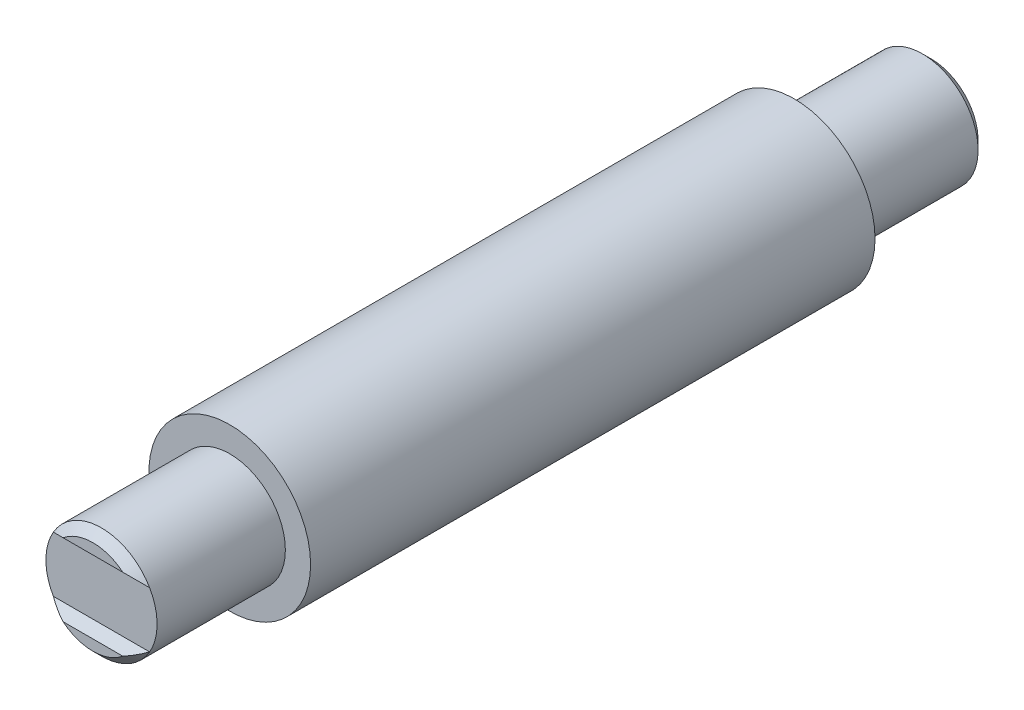
ISO-10303-21;
HEADER;
FILE_DESCRIPTION(('STEP AP214'),'2;1');
FILE_NAME('part.step','',(''),(''),'','','');
FILE_SCHEMA(('AUTOMOTIVE_DESIGN { 1 0 10303 214 1 1 1 1 }'));
ENDSEC;
DATA;
#1=APPLICATION_CONTEXT('core data for automotive mechanical design processes');
#2=APPLICATION_PROTOCOL_DEFINITION('international standard','automotive_design',2000,#1);
#3=PRODUCT_CONTEXT('',#1,'mechanical');
#4=PRODUCT('Part','Part','',(#3));
#5=PRODUCT_RELATED_PRODUCT_CATEGORY('part','',(#4));
#6=PRODUCT_DEFINITION_FORMATION('','',#4);
#7=PRODUCT_DEFINITION_CONTEXT('part definition',#1,'design');
#8=PRODUCT_DEFINITION('design','',#6,#7);
#9=PRODUCT_DEFINITION_SHAPE('','',#8);
#10=(LENGTH_UNIT() NAMED_UNIT(*) SI_UNIT(.MILLI.,.METRE.));
#11=(NAMED_UNIT(*) PLANE_ANGLE_UNIT() SI_UNIT($,.RADIAN.));
#12=(NAMED_UNIT(*) SI_UNIT($,.STERADIAN.) SOLID_ANGLE_UNIT());
#13=UNCERTAINTY_MEASURE_WITH_UNIT(LENGTH_MEASURE(1.E-05),#10,'distance_accuracy_value','');
#14=(GEOMETRIC_REPRESENTATION_CONTEXT(3) GLOBAL_UNCERTAINTY_ASSIGNED_CONTEXT((#13)) GLOBAL_UNIT_ASSIGNED_CONTEXT((#10,
#11,#12)) REPRESENTATION_CONTEXT('',''));
#15=CARTESIAN_POINT('',(0.,0.,0.));
#16=DIRECTION('',(0.,0.,1.));
#17=DIRECTION('',(1.,0.,0.));
#18=AXIS2_PLACEMENT_3D('',#15,#16,#17);
#19=CARTESIAN_POINT('',(0.,0.,82.));
#20=DIRECTION('',(0.,0.,1.));
#21=DIRECTION('',(1.,0.,0.));
#22=AXIS2_PLACEMENT_3D('',#19,#20,#21);
#23=PLANE('',#22);
#24=DIRECTION('',(1.,0.,0.));
#25=VECTOR('',#24,1.);
#26=CARTESIAN_POINT('',(5.7662812973354,4.25000000000001,82.));
#27=LINE('',#26,#25);
#28=CARTESIAN_POINT('',(-3.49106001094219,4.25000000000001,82.));
#29=VERTEX_POINT('',#28);
#30=CARTESIAN_POINT('',(3.49106001094219,4.25000000000001,82.));
#31=VERTEX_POINT('',#30);
#32=EDGE_CURVE('E102',#29,#31,#27,.T.);
#33=ORIENTED_EDGE('',*,*,#32,.T.);
#34=CARTESIAN_POINT('',(0.,0.,82.));
#35=DIRECTION('',(0.,0.,1.));
#36=DIRECTION('',(1.,0.,0.));
#37=AXIS2_PLACEMENT_3D('',#34,#35,#36);
#38=CIRCLE('',#37,5.49999999999998);
#39=EDGE_CURVE('E165',#31,#29,#38,.T.);
#40=ORIENTED_EDGE('',*,*,#39,.T.);
#41=EDGE_LOOP('',(#33,#40));
#42=FACE_BOUND('',#41,.T.);
#43=ADVANCED_FACE('F51',(#42),#23,.T.);
#44=CARTESIAN_POINT('',(0.,0.,66.));
#45=DIRECTION('',(0.,0.,-1.));
#46=DIRECTION('',(-1.,0.,0.));
#47=AXIS2_PLACEMENT_3D('',#44,#45,#46);
#48=CYLINDRICAL_SURFACE('',#47,9.45);
#49=CARTESIAN_POINT('',(0.,0.,66.));
#50=DIRECTION('',(0.,0.,1.));
#51=DIRECTION('',(1.,0.,0.));
#52=AXIS2_PLACEMENT_3D('',#49,#50,#51);
#53=CIRCLE('',#52,9.45);
#54=CARTESIAN_POINT('',(9.45,0.,66.));
#55=VERTEX_POINT('',#54);
#56=EDGE_CURVE('E189',#55,#55,#53,.T.);
#57=ORIENTED_EDGE('',*,*,#56,.F.);
#58=EDGE_LOOP('',(#57));
#59=FACE_BOUND('',#58,.T.);
#60=CARTESIAN_POINT('',(0.,0.,0.));
#61=DIRECTION('',(0.,0.,1.));
#62=DIRECTION('',(1.,0.,0.));
#63=AXIS2_PLACEMENT_3D('',#60,#61,#62);
#64=CIRCLE('',#63,9.45);
#65=CARTESIAN_POINT('',(9.45,0.,0.));
#66=VERTEX_POINT('',#65);
#67=EDGE_CURVE('E185',#66,#66,#64,.T.);
#68=ORIENTED_EDGE('',*,*,#67,.T.);
#69=EDGE_LOOP('',(#68));
#70=FACE_BOUND('',#69,.T.);
#71=ADVANCED_FACE('F206',(#59,#70),#48,.T.);
#72=CARTESIAN_POINT('',(0.,0.,66.));
#73=DIRECTION('',(0.,0.,1.));
#74=DIRECTION('',(1.,0.,0.));
#75=AXIS2_PLACEMENT_3D('',#72,#73,#74);
#76=PLANE('',#75);
#77=CARTESIAN_POINT('',(0.,0.,66.));
#78=DIRECTION('',(0.,0.,1.));
#79=DIRECTION('',(1.,0.,0.));
#80=AXIS2_PLACEMENT_3D('',#77,#78,#79);
#81=CIRCLE('',#80,6.5);
#82=CARTESIAN_POINT('',(6.5,0.,66.));
#83=VERTEX_POINT('',#82);
#84=EDGE_CURVE('E175',#83,#83,#81,.T.);
#85=ORIENTED_EDGE('',*,*,#84,.F.);
#86=EDGE_LOOP('',(#85));
#87=FACE_BOUND('',#86,.T.);
#88=ORIENTED_EDGE('',*,*,#56,.T.);
#89=EDGE_LOOP('',(#88));
#90=FACE_BOUND('',#89,.T.);
#91=ADVANCED_FACE('F202',(#87,#90),#76,.T.);
#92=CARTESIAN_POINT('',(0.,0.,0.));
#93=DIRECTION('',(0.,0.,1.));
#94=DIRECTION('',(1.,0.,0.));
#95=AXIS2_PLACEMENT_3D('',#92,#93,#94);
#96=PLANE('',#95);
#97=CARTESIAN_POINT('',(0.,0.,0.));
#98=DIRECTION('',(0.,0.,-1.));
#99=DIRECTION('',(-1.,0.,0.));
#100=AXIS2_PLACEMENT_3D('',#97,#98,#99);
#101=CIRCLE('',#100,6.5);
#102=CARTESIAN_POINT('',(-6.5,0.,0.));
#103=VERTEX_POINT('',#102);
#104=EDGE_CURVE('E184',#103,#103,#101,.T.);
#105=ORIENTED_EDGE('',*,*,#104,.F.);
#106=EDGE_LOOP('',(#105));
#107=FACE_BOUND('',#106,.T.);
#108=ORIENTED_EDGE('',*,*,#67,.F.);
#109=EDGE_LOOP('',(#108));
#110=FACE_BOUND('',#109,.T.);
#111=ADVANCED_FACE('F205',(#107,#110),#96,.F.);
#112=CARTESIAN_POINT('',(0.,0.,-16.));
#113=DIRECTION('',(0.,0.,1.));
#114=DIRECTION('',(1.,0.,0.));
#115=AXIS2_PLACEMENT_3D('',#112,#113,#114);
#116=CYLINDRICAL_SURFACE('',#115,6.5);
#117=CARTESIAN_POINT('',(0.,0.,-15.));
#118=DIRECTION('',(0.,0.,-1.));
#119=DIRECTION('',(-1.,0.,0.));
#120=AXIS2_PLACEMENT_3D('',#117,#118,#119);
#121=CIRCLE('',#120,6.5);
#122=CARTESIAN_POINT('',(-6.5,0.,-15.));
#123=VERTEX_POINT('',#122);
#124=EDGE_CURVE('E176',#123,#123,#121,.F.);
#125=ORIENTED_EDGE('',*,*,#124,.T.);
#126=EDGE_LOOP('',(#125));
#127=FACE_BOUND('',#126,.T.);
#128=ORIENTED_EDGE('',*,*,#104,.T.);
#129=EDGE_LOOP('',(#128));
#130=FACE_BOUND('',#129,.T.);
#131=ADVANCED_FACE('F216',(#127,#130),#116,.T.);
#132=CARTESIAN_POINT('',(0.,0.,-16.));
#133=DIRECTION('',(0.,0.,-1.));
#134=DIRECTION('',(-1.,0.,0.));
#135=AXIS2_PLACEMENT_3D('',#132,#133,#134);
#136=PLANE('',#135);
#137=CARTESIAN_POINT('',(0.,0.,-16.));
#138=DIRECTION('',(0.,0.,-1.));
#139=DIRECTION('',(-1.,0.,0.));
#140=AXIS2_PLACEMENT_3D('',#137,#138,#139);
#141=CIRCLE('',#140,5.50000000000001);
#142=CARTESIAN_POINT('',(-5.50000000000001,0.,-16.));
#143=VERTEX_POINT('',#142);
#144=EDGE_CURVE('E180',#143,#143,#141,.T.);
#145=ORIENTED_EDGE('',*,*,#144,.T.);
#146=EDGE_LOOP('',(#145));
#147=FACE_BOUND('',#146,.T.);
#148=ADVANCED_FACE('F222',(#147),#136,.T.);
#149=CARTESIAN_POINT('',(0.,0.,-16.));
#150=DIRECTION('',(0.,0.,1.));
#151=DIRECTION('',(1.,0.,0.));
#152=AXIS2_PLACEMENT_3D('',#149,#150,#151);
#153=CONICAL_SURFACE('',#152,5.50000000000001,0.785398163397444);
#154=ORIENTED_EDGE('',*,*,#124,.F.);
#155=EDGE_LOOP('',(#154));
#156=FACE_BOUND('',#155,.T.);
#157=ORIENTED_EDGE('',*,*,#144,.F.);
#158=EDGE_LOOP('',(#157));
#159=FACE_BOUND('',#158,.T.);
#160=ADVANCED_FACE('F240',(#156,#159),#153,.T.);
#161=CARTESIAN_POINT('',(0.,0.,82.));
#162=DIRECTION('',(0.,0.,-1.));
#163=DIRECTION('',(-1.,0.,0.));
#164=AXIS2_PLACEMENT_3D('',#161,#162,#163);
#165=CYLINDRICAL_SURFACE('',#164,6.5);
#166=CARTESIAN_POINT('',(0.,0.,81.));
#167=DIRECTION('',(0.,0.,1.));
#168=DIRECTION('',(1.,0.,0.));
#169=AXIS2_PLACEMENT_3D('',#166,#167,#168);
#170=CIRCLE('',#169,6.50000000000001);
#171=CARTESIAN_POINT('',(5.62916512459884,-3.25000000000001,81.));
#172=VERTEX_POINT('',#171);
#173=CARTESIAN_POINT('',(5.62916512459884,3.25000000000001,81.));
#174=VERTEX_POINT('',#173);
#175=EDGE_CURVE('E121',#172,#174,#170,.T.);
#176=ORIENTED_EDGE('',*,*,#175,.F.);
#177=CARTESIAN_POINT('',(0.,0.,81.));
#178=DIRECTION('',(0.,0.,1.));
#179=DIRECTION('',(1.,0.,0.));
#180=AXIS2_PLACEMENT_3D('',#177,#178,#179);
#181=CIRCLE('',#180,6.5);
#182=CARTESIAN_POINT('',(-5.62916512459884,-3.25000000000001,81.));
#183=VERTEX_POINT('',#182);
#184=EDGE_CURVE('E13',#172,#183,#181,.F.);
#185=ORIENTED_EDGE('',*,*,#184,.T.);
#186=CARTESIAN_POINT('',(0.,0.,81.));
#187=DIRECTION('',(0.,0.,1.));
#188=DIRECTION('',(-1.,0.,0.));
#189=AXIS2_PLACEMENT_3D('',#186,#187,#188);
#190=CIRCLE('',#189,6.50000000000001);
#191=CARTESIAN_POINT('',(-5.62916512459884,3.25000000000001,81.));
#192=VERTEX_POINT('',#191);
#193=EDGE_CURVE('E113',#192,#183,#190,.T.);
#194=ORIENTED_EDGE('',*,*,#193,.F.);
#195=CARTESIAN_POINT('',(0.,0.,81.));
#196=DIRECTION('',(0.,0.,1.));
#197=DIRECTION('',(1.,0.,0.));
#198=AXIS2_PLACEMENT_3D('',#195,#196,#197);
#199=CIRCLE('',#198,6.5);
#200=EDGE_CURVE('E108',#192,#174,#199,.F.);
#201=ORIENTED_EDGE('',*,*,#200,.T.);
#202=EDGE_LOOP('',(#176,#185,#194,#201));
#203=FACE_BOUND('',#202,.T.);
#204=ORIENTED_EDGE('',*,*,#84,.T.);
#205=EDGE_LOOP('',(#204));
#206=FACE_BOUND('',#205,.T.);
#207=ADVANCED_FACE('F115',(#203,#206),#165,.T.);
#208=DIRECTION('',(-1.,0.,0.));
#209=VECTOR('',#208,1.);
#210=CARTESIAN_POINT('',(-5.7662812973354,-4.25000000000001,82.));
#211=LINE('',#210,#209);
#212=CARTESIAN_POINT('',(3.49106001094219,-4.25000000000001,82.));
#213=VERTEX_POINT('',#212);
#214=CARTESIAN_POINT('',(-3.49106001094219,-4.25000000000001,82.));
#215=VERTEX_POINT('',#214);
#216=EDGE_CURVE('E125',#213,#215,#211,.T.);
#217=ORIENTED_EDGE('',*,*,#216,.T.);
#218=CARTESIAN_POINT('',(0.,0.,82.));
#219=DIRECTION('',(0.,0.,1.));
#220=DIRECTION('',(1.,0.,0.));
#221=AXIS2_PLACEMENT_3D('',#218,#219,#220);
#222=CIRCLE('',#221,5.49999999999998);
#223=EDGE_CURVE('E129',#215,#213,#222,.T.);
#224=ORIENTED_EDGE('',*,*,#223,.T.);
#225=EDGE_LOOP('',(#217,#224));
#226=FACE_BOUND('',#225,.T.);
#227=ADVANCED_FACE('F229',(#226),#23,.T.);
#228=CARTESIAN_POINT('',(0.,0.,81.));
#229=DIRECTION('',(0.,0.,-1.));
#230=DIRECTION('',(-1.,0.,0.));
#231=AXIS2_PLACEMENT_3D('',#228,#229,#230);
#232=PLANE('',#231);
#233=ORIENTED_EDGE('',*,*,#193,.T.);
#234=DIRECTION('',(1.,0.,0.));
#235=VECTOR('',#234,1.);
#236=CARTESIAN_POINT('',(0.,-3.25000000000001,81.));
#237=LINE('',#236,#235);
#238=EDGE_CURVE('E168',#183,#172,#237,.T.);
#239=ORIENTED_EDGE('',*,*,#238,.T.);
#240=ORIENTED_EDGE('',*,*,#175,.T.);
#241=DIRECTION('',(-1.,0.,0.));
#242=VECTOR('',#241,1.);
#243=CARTESIAN_POINT('',(0.,3.25000000000001,81.));
#244=LINE('',#243,#242);
#245=EDGE_CURVE('E99',#174,#192,#244,.T.);
#246=ORIENTED_EDGE('',*,*,#245,.T.);
#247=EDGE_LOOP('',(#233,#239,#240,#246));
#248=FACE_BOUND('',#247,.T.);
#249=ADVANCED_FACE('F123',(#248),#232,.F.);
#250=CARTESIAN_POINT('',(5.7662812973354,3.,80.75));
#251=DIRECTION('',(0.,-0.707106781186549,0.707106781186546));
#252=DIRECTION('',(1.,0.,0.));
#253=AXIS2_PLACEMENT_3D('',#250,#251,#252);
#254=PLANE('',#253);
#255=ORIENTED_EDGE('',*,*,#32,.F.);
#256=CARTESIAN_POINT('',(-3.49106001094219,4.25000000000001,82.));
#257=CARTESIAN_POINT('',(-3.68239553774479,4.18148274366632,81.9314827436663));
#258=CARTESIAN_POINT('',(-3.87045250616271,4.10852404514222,81.8585240451422));
#259=CARTESIAN_POINT('',(-4.23954507685793,3.95501285970541,81.7050128597054));
#260=CARTESIAN_POINT('',(-4.42059942375925,3.87448296000847,81.6244829600085));
#261=CARTESIAN_POINT('',(-4.77621460173128,3.70676349561471,81.4567634956147));
#262=CARTESIAN_POINT('',(-4.95077953684419,3.61957825023226,81.3695782502323));
#263=CARTESIAN_POINT('',(-5.29428188671203,3.43910678070214,81.1891067807021));
#264=CARTESIAN_POINT('',(-5.46320151900871,3.34580360152984,81.0958036015298));
#265=CARTESIAN_POINT('',(-5.62916512459885,3.25,81.));
#266=B_SPLINE_CURVE_WITH_KNOTS('',3,(#256,#257,#258,#259,#260,#261,#262,#263,#264,#265),
.UNSPECIFIED.,.F.,.F.,(4,2,2,2,4),(0.,0.64317631510953,1.28449129835394,1.92539355054161,
2.56815389398791),.UNSPECIFIED.);
#267=EDGE_CURVE('E95',#29,#192,#266,.T.);
#268=ORIENTED_EDGE('',*,*,#267,.T.);
#269=ORIENTED_EDGE('',*,*,#245,.F.);
#270=CARTESIAN_POINT('',(5.62916512459885,3.25,81.));
#271=CARTESIAN_POINT('',(5.46320151900871,3.34580360152984,81.0958036015298));
#272=CARTESIAN_POINT('',(5.29428188671203,3.43910678070214,81.1891067807021));
#273=CARTESIAN_POINT('',(4.95077953684419,3.61957825023226,81.3695782502323));
#274=CARTESIAN_POINT('',(4.77621460173128,3.70676349561471,81.4567634956147));
#275=CARTESIAN_POINT('',(4.42059942375925,3.87448296000847,81.6244829600085));
#276=CARTESIAN_POINT('',(4.23954507685793,3.95501285970541,81.7050128597054));
#277=CARTESIAN_POINT('',(3.87045250616271,4.10852404514222,81.8585240451422));
#278=CARTESIAN_POINT('',(3.68239553774479,4.18148274366632,81.9314827436663));
#279=CARTESIAN_POINT('',(3.49106001094219,4.25000000000001,82.));
#280=B_SPLINE_CURVE_WITH_KNOTS('',3,(#270,#271,#272,#273,#274,#275,#276,#277,#278,#279),
.UNSPECIFIED.,.F.,.F.,(4,2,2,2,4),(0.,0.642760343446298,1.28366259563397,1.92497757887838,
2.56815389398791),.UNSPECIFIED.);
#281=EDGE_CURVE('E109',#174,#31,#280,.T.);
#282=ORIENTED_EDGE('',*,*,#281,.T.);
#283=EDGE_LOOP('',(#255,#268,#269,#282));
#284=FACE_BOUND('',#283,.T.);
#285=ADVANCED_FACE('F97',(#284),#254,.T.);
#286=CARTESIAN_POINT('',(5.7662812973354,-3.,80.75));
#287=DIRECTION('',(0.,0.707106781186549,0.707106781186546));
#288=DIRECTION('',(-1.,0.,0.));
#289=AXIS2_PLACEMENT_3D('',#286,#287,#288);
#290=PLANE('',#289);
#291=ORIENTED_EDGE('',*,*,#216,.F.);
#292=CARTESIAN_POINT('',(3.49106001094219,-4.25000000000001,82.));
#293=CARTESIAN_POINT('',(3.68239553774479,-4.18148274366632,81.9314827436663));
#294=CARTESIAN_POINT('',(3.87045250616271,-4.10852404514222,81.8585240451422));
#295=CARTESIAN_POINT('',(4.23954507685793,-3.95501285970541,81.7050128597054));
#296=CARTESIAN_POINT('',(4.42059942375925,-3.87448296000847,81.6244829600085));
#297=CARTESIAN_POINT('',(4.77621460173128,-3.70676349561471,81.4567634956147));
#298=CARTESIAN_POINT('',(4.95077953684419,-3.61957825023226,81.3695782502323));
#299=CARTESIAN_POINT('',(5.29428188671203,-3.43910678070214,81.1891067807021));
#300=CARTESIAN_POINT('',(5.46320151900871,-3.34580360152984,81.0958036015298));
#301=CARTESIAN_POINT('',(5.62916512459885,-3.25,81.));
#302=B_SPLINE_CURVE_WITH_KNOTS('',3,(#292,#293,#294,#295,#296,#297,#298,#299,#300,#301),
.UNSPECIFIED.,.F.,.F.,(4,2,2,2,4),(0.,0.64317631510953,1.28449129835394,1.92539355054161,
2.56815389398791),.UNSPECIFIED.);
#303=EDGE_CURVE('E61',#213,#172,#302,.T.);
#304=ORIENTED_EDGE('',*,*,#303,.T.);
#305=ORIENTED_EDGE('',*,*,#238,.F.);
#306=CARTESIAN_POINT('',(-5.62916512459885,-3.25,81.));
#307=CARTESIAN_POINT('',(-5.46320151900871,-3.34580360152984,81.0958036015298));
#308=CARTESIAN_POINT('',(-5.29428188671203,-3.43910678070214,81.1891067807021));
#309=CARTESIAN_POINT('',(-4.95077953684419,-3.61957825023226,81.3695782502323));
#310=CARTESIAN_POINT('',(-4.77621460173128,-3.70676349561471,81.4567634956147));
#311=CARTESIAN_POINT('',(-4.42059942375925,-3.87448296000847,81.6244829600085));
#312=CARTESIAN_POINT('',(-4.23954507685793,-3.95501285970541,81.7050128597054));
#313=CARTESIAN_POINT('',(-3.87045250616271,-4.10852404514222,81.8585240451422));
#314=CARTESIAN_POINT('',(-3.68239553774479,-4.18148274366632,81.9314827436663));
#315=CARTESIAN_POINT('',(-3.49106001094219,-4.25000000000001,82.));
#316=B_SPLINE_CURVE_WITH_KNOTS('',3,(#306,#307,#308,#309,#310,#311,#312,#313,#314,#315),
.UNSPECIFIED.,.F.,.F.,(4,2,2,2,4),(0.,0.642760343446298,1.28366259563397,1.92497757887838,
2.56815389398791),.UNSPECIFIED.);
#317=EDGE_CURVE('E68',#183,#215,#316,.T.);
#318=ORIENTED_EDGE('',*,*,#317,.T.);
#319=EDGE_LOOP('',(#291,#304,#305,#318));
#320=FACE_BOUND('',#319,.T.);
#321=ADVANCED_FACE('F150',(#320),#290,.T.);
#322=CARTESIAN_POINT('',(0.,0.,82.));
#323=DIRECTION('',(0.,0.,-1.));
#324=DIRECTION('',(-1.,0.,0.));
#325=AXIS2_PLACEMENT_3D('',#322,#323,#324);
#326=CONICAL_SURFACE('',#325,5.49999999999998,0.785398163397453);
#327=ORIENTED_EDGE('',*,*,#281,.F.);
#328=ORIENTED_EDGE('',*,*,#200,.F.);
#329=ORIENTED_EDGE('',*,*,#267,.F.);
#330=ORIENTED_EDGE('',*,*,#39,.F.);
#331=EDGE_LOOP('',(#327,#328,#329,#330));
#332=FACE_BOUND('',#331,.T.);
#333=ADVANCED_FACE('F127',(#332),#326,.T.);
#334=CARTESIAN_POINT('',(0.,0.,82.));
#335=DIRECTION('',(0.,0.,-1.));
#336=DIRECTION('',(-1.,0.,0.));
#337=AXIS2_PLACEMENT_3D('',#334,#335,#336);
#338=CONICAL_SURFACE('',#337,5.49999999999998,0.785398163397453);
#339=ORIENTED_EDGE('',*,*,#317,.F.);
#340=ORIENTED_EDGE('',*,*,#184,.F.);
#341=ORIENTED_EDGE('',*,*,#303,.F.);
#342=ORIENTED_EDGE('',*,*,#223,.F.);
#343=EDGE_LOOP('',(#339,#340,#341,#342));
#344=FACE_BOUND('',#343,.T.);
#345=ADVANCED_FACE('F53',(#344),#338,.T.);
#346=CLOSED_SHELL('',(#43,#71,#91,#111,#131,#148,#160,#207,#227,#249,#285,#321,#333,#345));
#347=MANIFOLD_SOLID_BREP('B2',#346);
#348=ADVANCED_BREP_SHAPE_REPRESENTATION('',(#18,#347),#14);
#349=SHAPE_DEFINITION_REPRESENTATION(#9,#348);
ENDSEC;
END-ISO-10303-21;
